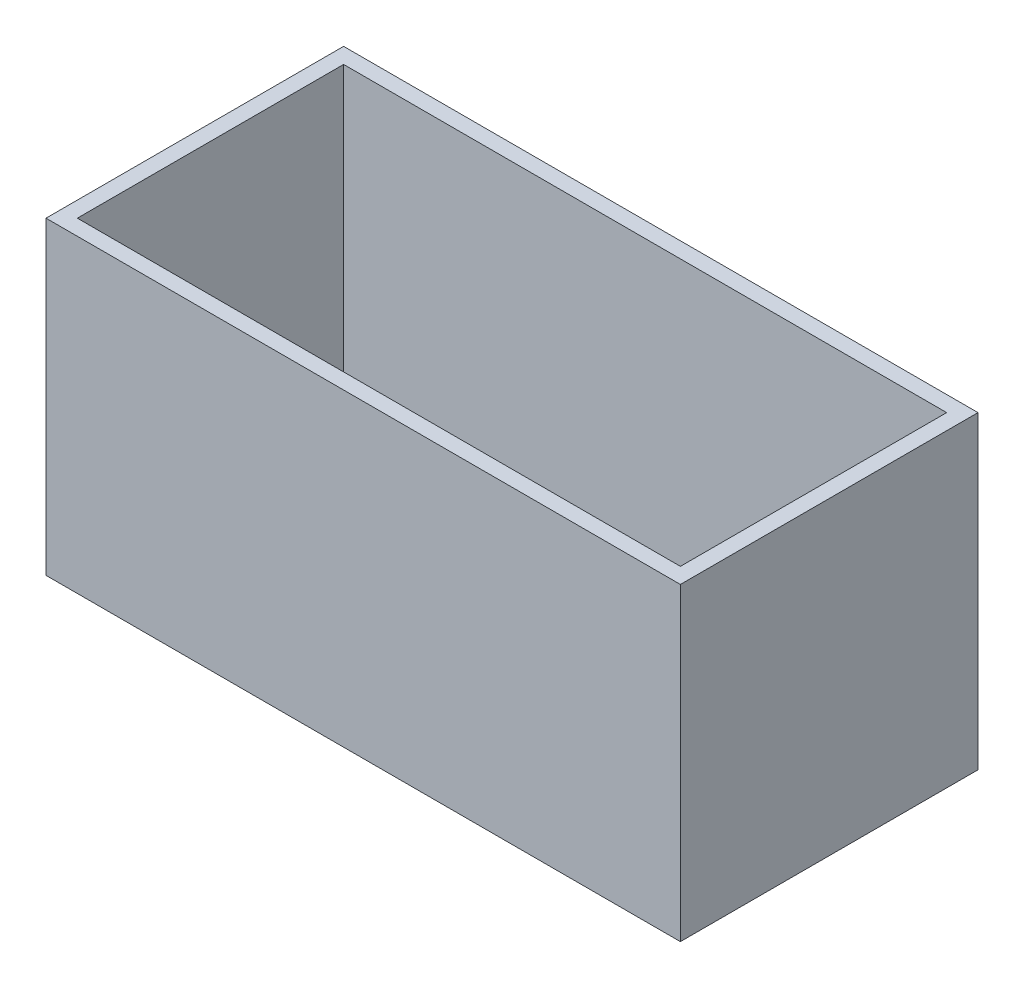
ISO-10303-21;
HEADER;
FILE_DESCRIPTION(('STEP AP214'),'2;1');
FILE_NAME('part.step','',(''),(''),'','','');
FILE_SCHEMA(('AUTOMOTIVE_DESIGN { 1 0 10303 214 1 1 1 1 }'));
ENDSEC;
DATA;
#1=APPLICATION_CONTEXT('core data for automotive mechanical design processes');
#2=APPLICATION_PROTOCOL_DEFINITION('international standard','automotive_design',2000,#1);
#3=PRODUCT_CONTEXT('',#1,'mechanical');
#4=PRODUCT('Part','Part','',(#3));
#5=PRODUCT_RELATED_PRODUCT_CATEGORY('part','',(#4));
#6=PRODUCT_DEFINITION_FORMATION('','',#4);
#7=PRODUCT_DEFINITION_CONTEXT('part definition',#1,'design');
#8=PRODUCT_DEFINITION('design','',#6,#7);
#9=PRODUCT_DEFINITION_SHAPE('','',#8);
#10=(LENGTH_UNIT() NAMED_UNIT(*) SI_UNIT(.MILLI.,.METRE.));
#11=(NAMED_UNIT(*) PLANE_ANGLE_UNIT() SI_UNIT($,.RADIAN.));
#12=(NAMED_UNIT(*) SI_UNIT($,.STERADIAN.) SOLID_ANGLE_UNIT());
#13=UNCERTAINTY_MEASURE_WITH_UNIT(LENGTH_MEASURE(1.E-05),#10,'distance_accuracy_value','');
#14=(GEOMETRIC_REPRESENTATION_CONTEXT(3) GLOBAL_UNCERTAINTY_ASSIGNED_CONTEXT((#13)) GLOBAL_UNIT_ASSIGNED_CONTEXT((#10,
#11,#12)) REPRESENTATION_CONTEXT('',''));
#15=CARTESIAN_POINT('',(0.,0.,0.));
#16=DIRECTION('',(0.,0.,1.));
#17=DIRECTION('',(1.,0.,0.));
#18=AXIS2_PLACEMENT_3D('',#15,#16,#17);
#19=CARTESIAN_POINT('',(102.87,5.08,48.26));
#20=DIRECTION('',(-1.,0.,0.));
#21=DIRECTION('',(0.,0.,1.));
#22=AXIS2_PLACEMENT_3D('',#19,#20,#21);
#23=PLANE('',#22);
#24=DIRECTION('',(0.,0.,-1.));
#25=VECTOR('',#24,1.);
#26=CARTESIAN_POINT('',(102.87,0.,48.26));
#27=LINE('',#26,#25);
#28=CARTESIAN_POINT('',(102.87,0.,48.26));
#29=VERTEX_POINT('',#28);
#30=CARTESIAN_POINT('',(102.87,0.,-48.26));
#31=VERTEX_POINT('',#30);
#32=EDGE_CURVE('E191',#29,#31,#27,.T.);
#33=ORIENTED_EDGE('',*,*,#32,.T.);
#34=DIRECTION('',(0.,-1.,0.));
#35=VECTOR('',#34,1.);
#36=CARTESIAN_POINT('',(102.87,5.08,-48.26));
#37=LINE('',#36,#35);
#38=CARTESIAN_POINT('',(102.87,100.33,-48.26));
#39=VERTEX_POINT('',#38);
#40=EDGE_CURVE('E209',#39,#31,#37,.T.);
#41=ORIENTED_EDGE('',*,*,#40,.F.);
#42=DIRECTION('',(0.,0.,-1.));
#43=VECTOR('',#42,1.);
#44=CARTESIAN_POINT('',(102.87,100.33,-48.26));
#45=LINE('',#44,#43);
#46=CARTESIAN_POINT('',(102.87,100.33,48.26));
#47=VERTEX_POINT('',#46);
#48=EDGE_CURVE('E185',#47,#39,#45,.T.);
#49=ORIENTED_EDGE('',*,*,#48,.F.);
#50=DIRECTION('',(0.,-1.,0.));
#51=VECTOR('',#50,1.);
#52=CARTESIAN_POINT('',(102.87,5.08,48.26));
#53=LINE('',#52,#51);
#54=EDGE_CURVE('E200',#47,#29,#53,.T.);
#55=ORIENTED_EDGE('',*,*,#54,.T.);
#56=EDGE_LOOP('',(#33,#41,#49,#55));
#57=FACE_BOUND('',#56,.T.);
#58=ADVANCED_FACE('F33',(#57),#23,.F.);
#59=CARTESIAN_POINT('',(-102.87,5.08,-48.26));
#60=DIRECTION('',(0.,0.,1.));
#61=DIRECTION('',(1.,0.,0.));
#62=AXIS2_PLACEMENT_3D('',#59,#60,#61);
#63=PLANE('',#62);
#64=DIRECTION('',(-1.,0.,0.));
#65=VECTOR('',#64,1.);
#66=CARTESIAN_POINT('',(-102.87,0.,-48.26));
#67=LINE('',#66,#65);
#68=CARTESIAN_POINT('',(-102.87,0.,-48.26));
#69=VERTEX_POINT('',#68);
#70=EDGE_CURVE('E194',#31,#69,#67,.T.);
#71=ORIENTED_EDGE('',*,*,#70,.T.);
#72=DIRECTION('',(0.,-1.,0.));
#73=VECTOR('',#72,1.);
#74=CARTESIAN_POINT('',(-102.87,5.08,-48.26));
#75=LINE('',#74,#73);
#76=CARTESIAN_POINT('',(-102.87,100.33,-48.26));
#77=VERTEX_POINT('',#76);
#78=EDGE_CURVE('E206',#77,#69,#75,.T.);
#79=ORIENTED_EDGE('',*,*,#78,.F.);
#80=DIRECTION('',(-1.,0.,0.));
#81=VECTOR('',#80,1.);
#82=CARTESIAN_POINT('',(-102.87,100.33,-48.26));
#83=LINE('',#82,#81);
#84=EDGE_CURVE('E188',#39,#77,#83,.T.);
#85=ORIENTED_EDGE('',*,*,#84,.F.);
#86=ORIENTED_EDGE('',*,*,#40,.T.);
#87=EDGE_LOOP('',(#71,#79,#85,#86));
#88=FACE_BOUND('',#87,.T.);
#89=ADVANCED_FACE('F234',(#88),#63,.F.);
#90=CARTESIAN_POINT('',(-102.87,5.08,48.26));
#91=DIRECTION('',(1.,0.,0.));
#92=DIRECTION('',(0.,0.,-1.));
#93=AXIS2_PLACEMENT_3D('',#90,#91,#92);
#94=PLANE('',#93);
#95=DIRECTION('',(0.,0.,1.));
#96=VECTOR('',#95,1.);
#97=CARTESIAN_POINT('',(-102.87,0.,48.26));
#98=LINE('',#97,#96);
#99=CARTESIAN_POINT('',(-102.87,0.,48.26));
#100=VERTEX_POINT('',#99);
#101=EDGE_CURVE('E196',#69,#100,#98,.T.);
#102=ORIENTED_EDGE('',*,*,#101,.T.);
#103=DIRECTION('',(0.,-1.,0.));
#104=VECTOR('',#103,1.);
#105=CARTESIAN_POINT('',(-102.87,5.08,48.26));
#106=LINE('',#105,#104);
#107=CARTESIAN_POINT('',(-102.87,100.33,48.26));
#108=VERTEX_POINT('',#107);
#109=EDGE_CURVE('E203',#108,#100,#106,.T.);
#110=ORIENTED_EDGE('',*,*,#109,.F.);
#111=DIRECTION('',(0.,0.,1.));
#112=VECTOR('',#111,1.);
#113=CARTESIAN_POINT('',(-102.87,100.33,48.26));
#114=LINE('',#113,#112);
#115=EDGE_CURVE('E179',#77,#108,#114,.T.);
#116=ORIENTED_EDGE('',*,*,#115,.F.);
#117=ORIENTED_EDGE('',*,*,#78,.T.);
#118=EDGE_LOOP('',(#102,#110,#116,#117));
#119=FACE_BOUND('',#118,.T.);
#120=ADVANCED_FACE('F239',(#119),#94,.F.);
#121=CARTESIAN_POINT('',(-102.87,5.08,48.26));
#122=DIRECTION('',(0.,0.,-1.));
#123=DIRECTION('',(-1.,0.,0.));
#124=AXIS2_PLACEMENT_3D('',#121,#122,#123);
#125=PLANE('',#124);
#126=DIRECTION('',(1.,0.,0.));
#127=VECTOR('',#126,1.);
#128=CARTESIAN_POINT('',(-102.87,0.,48.26));
#129=LINE('',#128,#127);
#130=EDGE_CURVE('E198',#100,#29,#129,.T.);
#131=ORIENTED_EDGE('',*,*,#130,.T.);
#132=ORIENTED_EDGE('',*,*,#54,.F.);
#133=DIRECTION('',(1.,0.,0.));
#134=VECTOR('',#133,1.);
#135=CARTESIAN_POINT('',(102.87,100.33,48.26));
#136=LINE('',#135,#134);
#137=EDGE_CURVE('E182',#108,#47,#136,.T.);
#138=ORIENTED_EDGE('',*,*,#137,.F.);
#139=ORIENTED_EDGE('',*,*,#109,.T.);
#140=EDGE_LOOP('',(#131,#132,#138,#139));
#141=FACE_BOUND('',#140,.T.);
#142=ADVANCED_FACE('F253',(#141),#125,.F.);
#143=CARTESIAN_POINT('',(0.,0.,0.));
#144=DIRECTION('',(0.,-1.,0.));
#145=DIRECTION('',(0.,0.,-1.));
#146=AXIS2_PLACEMENT_3D('',#143,#144,#145);
#147=PLANE('',#146);
#148=DIRECTION('',(0.,0.,1.));
#149=VECTOR('',#148,1.);
#150=CARTESIAN_POINT('',(11.2450040576355,0.,41.2070214480463));
#151=LINE('',#150,#149);
#152=CARTESIAN_POINT('',(11.2450040576355,0.,32.9212289845254));
#153=VERTEX_POINT('',#152);
#154=CARTESIAN_POINT('',(11.2450040576355,0.,41.2070214480463));
#155=VERTEX_POINT('',#154);
#156=EDGE_CURVE('E47',#153,#155,#151,.T.);
#157=ORIENTED_EDGE('',*,*,#156,.F.);
#158=DIRECTION('',(1.,0.,0.));
#159=VECTOR('',#158,1.);
#160=CARTESIAN_POINT('',(-11.2450040576355,0.,32.9212289845254));
#161=LINE('',#160,#159);
#162=CARTESIAN_POINT('',(-11.2450040576355,0.,32.9212289845254));
#163=VERTEX_POINT('',#162);
#164=EDGE_CURVE('E140',#163,#153,#161,.T.);
#165=ORIENTED_EDGE('',*,*,#164,.F.);
#166=DIRECTION('',(0.,0.,-1.));
#167=VECTOR('',#166,1.);
#168=CARTESIAN_POINT('',(-11.2450040576355,0.,41.2070214480463));
#169=LINE('',#168,#167);
#170=CARTESIAN_POINT('',(-11.2450040576355,0.,41.2070214480463));
#171=VERTEX_POINT('',#170);
#172=EDGE_CURVE('E124',#171,#163,#169,.T.);
#173=ORIENTED_EDGE('',*,*,#172,.F.);
#174=DIRECTION('',(-1.,0.,0.));
#175=VECTOR('',#174,1.);
#176=CARTESIAN_POINT('',(-11.2450040576355,0.,41.2070214480463));
#177=LINE('',#176,#175);
#178=EDGE_CURVE('E133',#155,#171,#177,.T.);
#179=ORIENTED_EDGE('',*,*,#178,.F.);
#180=EDGE_LOOP('',(#157,#165,#173,#179));
#181=FACE_BOUND('',#180,.T.);
#182=ORIENTED_EDGE('',*,*,#32,.F.);
#183=ORIENTED_EDGE('',*,*,#130,.F.);
#184=ORIENTED_EDGE('',*,*,#101,.F.);
#185=ORIENTED_EDGE('',*,*,#70,.F.);
#186=EDGE_LOOP('',(#182,#183,#184,#185));
#187=FACE_BOUND('',#186,.T.);
#188=ADVANCED_FACE('F137',(#181,#187),#147,.T.);
#189=CARTESIAN_POINT('',(0.,100.33,0.));
#190=DIRECTION('',(0.,-1.,0.));
#191=DIRECTION('',(0.,0.,-1.));
#192=AXIS2_PLACEMENT_3D('',#189,#190,#191);
#193=PLANE('',#192);
#194=ORIENTED_EDGE('',*,*,#115,.T.);
#195=ORIENTED_EDGE('',*,*,#137,.T.);
#196=ORIENTED_EDGE('',*,*,#48,.T.);
#197=ORIENTED_EDGE('',*,*,#84,.T.);
#198=EDGE_LOOP('',(#194,#195,#196,#197));
#199=FACE_BOUND('',#198,.T.);
#200=DIRECTION('',(1.,0.,0.));
#201=VECTOR('',#200,1.);
#202=CARTESIAN_POINT('',(-97.79,100.33,43.18));
#203=LINE('',#202,#201);
#204=CARTESIAN_POINT('',(-97.79,100.33,43.18));
#205=VERTEX_POINT('',#204);
#206=CARTESIAN_POINT('',(97.79,100.33,43.18));
#207=VERTEX_POINT('',#206);
#208=EDGE_CURVE('E150',#205,#207,#203,.T.);
#209=ORIENTED_EDGE('',*,*,#208,.F.);
#210=DIRECTION('',(0.,0.,1.));
#211=VECTOR('',#210,1.);
#212=CARTESIAN_POINT('',(-97.79,100.33,-43.18));
#213=LINE('',#212,#211);
#214=CARTESIAN_POINT('',(-97.79,100.33,-43.18));
#215=VERTEX_POINT('',#214);
#216=EDGE_CURVE('E158',#215,#205,#213,.T.);
#217=ORIENTED_EDGE('',*,*,#216,.F.);
#218=DIRECTION('',(-1.,0.,0.));
#219=VECTOR('',#218,1.);
#220=CARTESIAN_POINT('',(97.79,100.33,-43.18));
#221=LINE('',#220,#219);
#222=CARTESIAN_POINT('',(97.79,100.33,-43.18));
#223=VERTEX_POINT('',#222);
#224=EDGE_CURVE('E155',#223,#215,#221,.T.);
#225=ORIENTED_EDGE('',*,*,#224,.F.);
#226=DIRECTION('',(0.,0.,-1.));
#227=VECTOR('',#226,1.);
#228=CARTESIAN_POINT('',(97.79,100.33,43.18));
#229=LINE('',#228,#227);
#230=EDGE_CURVE('E152',#207,#223,#229,.T.);
#231=ORIENTED_EDGE('',*,*,#230,.F.);
#232=EDGE_LOOP('',(#209,#217,#225,#231));
#233=FACE_BOUND('',#232,.T.);
#234=ADVANCED_FACE('F248',(#199,#233),#193,.F.);
#235=CARTESIAN_POINT('',(-97.79,100.33,43.18));
#236=DIRECTION('',(0.,0.,-1.));
#237=DIRECTION('',(-1.,0.,0.));
#238=AXIS2_PLACEMENT_3D('',#235,#236,#237);
#239=PLANE('',#238);
#240=DIRECTION('',(1.,0.,0.));
#241=VECTOR('',#240,1.);
#242=CARTESIAN_POINT('',(-97.79,5.08,43.18));
#243=LINE('',#242,#241);
#244=CARTESIAN_POINT('',(-97.79,5.08,43.18));
#245=VERTEX_POINT('',#244);
#246=CARTESIAN_POINT('',(97.79,5.08,43.18));
#247=VERTEX_POINT('',#246);
#248=EDGE_CURVE('E147',#245,#247,#243,.T.);
#249=ORIENTED_EDGE('',*,*,#248,.F.);
#250=DIRECTION('',(0.,-1.,0.));
#251=VECTOR('',#250,1.);
#252=CARTESIAN_POINT('',(-97.79,100.33,43.18));
#253=LINE('',#252,#251);
#254=EDGE_CURVE('E160',#205,#245,#253,.T.);
#255=ORIENTED_EDGE('',*,*,#254,.F.);
#256=ORIENTED_EDGE('',*,*,#208,.T.);
#257=DIRECTION('',(0.,-1.,0.));
#258=VECTOR('',#257,1.);
#259=CARTESIAN_POINT('',(97.79,100.33,43.18));
#260=LINE('',#259,#258);
#261=EDGE_CURVE('E176',#207,#247,#260,.T.);
#262=ORIENTED_EDGE('',*,*,#261,.T.);
#263=EDGE_LOOP('',(#249,#255,#256,#262));
#264=FACE_BOUND('',#263,.T.);
#265=ADVANCED_FACE('F265',(#264),#239,.T.);
#266=CARTESIAN_POINT('',(97.79,100.33,43.18));
#267=DIRECTION('',(-1.,0.,0.));
#268=DIRECTION('',(0.,0.,1.));
#269=AXIS2_PLACEMENT_3D('',#266,#267,#268);
#270=PLANE('',#269);
#271=DIRECTION('',(0.,0.,-1.));
#272=VECTOR('',#271,1.);
#273=CARTESIAN_POINT('',(97.79,5.08,43.18));
#274=LINE('',#273,#272);
#275=CARTESIAN_POINT('',(97.79,5.08,-43.18));
#276=VERTEX_POINT('',#275);
#277=EDGE_CURVE('E163',#247,#276,#274,.T.);
#278=ORIENTED_EDGE('',*,*,#277,.F.);
#279=ORIENTED_EDGE('',*,*,#261,.F.);
#280=ORIENTED_EDGE('',*,*,#230,.T.);
#281=DIRECTION('',(0.,-1.,0.));
#282=VECTOR('',#281,1.);
#283=CARTESIAN_POINT('',(97.79,100.33,-43.18));
#284=LINE('',#283,#282);
#285=EDGE_CURVE('E174',#223,#276,#284,.T.);
#286=ORIENTED_EDGE('',*,*,#285,.T.);
#287=EDGE_LOOP('',(#278,#279,#280,#286));
#288=FACE_BOUND('',#287,.T.);
#289=ADVANCED_FACE('F268',(#288),#270,.T.);
#290=CARTESIAN_POINT('',(97.79,100.33,-43.18));
#291=DIRECTION('',(0.,0.,1.));
#292=DIRECTION('',(1.,0.,0.));
#293=AXIS2_PLACEMENT_3D('',#290,#291,#292);
#294=PLANE('',#293);
#295=DIRECTION('',(-1.,0.,0.));
#296=VECTOR('',#295,1.);
#297=CARTESIAN_POINT('',(97.79,5.08,-43.18));
#298=LINE('',#297,#296);
#299=CARTESIAN_POINT('',(-97.79,5.08,-43.18));
#300=VERTEX_POINT('',#299);
#301=EDGE_CURVE('E166',#276,#300,#298,.T.);
#302=ORIENTED_EDGE('',*,*,#301,.F.);
#303=ORIENTED_EDGE('',*,*,#285,.F.);
#304=ORIENTED_EDGE('',*,*,#224,.T.);
#305=DIRECTION('',(0.,-1.,0.));
#306=VECTOR('',#305,1.);
#307=CARTESIAN_POINT('',(-97.79,100.33,-43.18));
#308=LINE('',#307,#306);
#309=EDGE_CURVE('E172',#215,#300,#308,.T.);
#310=ORIENTED_EDGE('',*,*,#309,.T.);
#311=EDGE_LOOP('',(#302,#303,#304,#310));
#312=FACE_BOUND('',#311,.T.);
#313=ADVANCED_FACE('F272',(#312),#294,.T.);
#314=CARTESIAN_POINT('',(-97.79,100.33,-43.18));
#315=DIRECTION('',(1.,0.,0.));
#316=DIRECTION('',(0.,0.,-1.));
#317=AXIS2_PLACEMENT_3D('',#314,#315,#316);
#318=PLANE('',#317);
#319=DIRECTION('',(0.,0.,1.));
#320=VECTOR('',#319,1.);
#321=CARTESIAN_POINT('',(-97.79,5.08,-43.18));
#322=LINE('',#321,#320);
#323=EDGE_CURVE('E153',#300,#245,#322,.T.);
#324=ORIENTED_EDGE('',*,*,#323,.F.);
#325=ORIENTED_EDGE('',*,*,#309,.F.);
#326=ORIENTED_EDGE('',*,*,#216,.T.);
#327=ORIENTED_EDGE('',*,*,#254,.T.);
#328=EDGE_LOOP('',(#324,#325,#326,#327));
#329=FACE_BOUND('',#328,.T.);
#330=ADVANCED_FACE('F229',(#329),#318,.T.);
#331=CARTESIAN_POINT('',(0.,5.08,0.));
#332=DIRECTION('',(0.,-1.,0.));
#333=DIRECTION('',(0.,0.,-1.));
#334=AXIS2_PLACEMENT_3D('',#331,#332,#333);
#335=PLANE('',#334);
#336=DIRECTION('',(1.,0.,0.));
#337=VECTOR('',#336,1.);
#338=CARTESIAN_POINT('',(0.,5.08,32.9212289845254));
#339=LINE('',#338,#337);
#340=CARTESIAN_POINT('',(-11.2450040576355,5.08,32.9212289845254));
#341=VERTEX_POINT('',#340);
#342=CARTESIAN_POINT('',(11.2450040576355,5.08,32.9212289845254));
#343=VERTEX_POINT('',#342);
#344=EDGE_CURVE('E40',#341,#343,#339,.T.);
#345=ORIENTED_EDGE('',*,*,#344,.T.);
#346=DIRECTION('',(0.,0.,1.));
#347=VECTOR('',#346,1.);
#348=CARTESIAN_POINT('',(11.2450040576355,5.08,0.));
#349=LINE('',#348,#347);
#350=CARTESIAN_POINT('',(11.2450040576355,5.08,41.2070214480463));
#351=VERTEX_POINT('',#350);
#352=EDGE_CURVE('E11',#343,#351,#349,.T.);
#353=ORIENTED_EDGE('',*,*,#352,.T.);
#354=DIRECTION('',(-1.,0.,0.));
#355=VECTOR('',#354,1.);
#356=CARTESIAN_POINT('',(0.,5.08,41.2070214480463));
#357=LINE('',#356,#355);
#358=CARTESIAN_POINT('',(-11.2450040576355,5.08,41.2070214480463));
#359=VERTEX_POINT('',#358);
#360=EDGE_CURVE('E212',#351,#359,#357,.T.);
#361=ORIENTED_EDGE('',*,*,#360,.T.);
#362=DIRECTION('',(0.,0.,-1.));
#363=VECTOR('',#362,1.);
#364=CARTESIAN_POINT('',(-11.2450040576355,5.08,0.));
#365=LINE('',#364,#363);
#366=EDGE_CURVE('E127',#359,#341,#365,.T.);
#367=ORIENTED_EDGE('',*,*,#366,.T.);
#368=EDGE_LOOP('',(#345,#353,#361,#367));
#369=FACE_BOUND('',#368,.T.);
#370=ORIENTED_EDGE('',*,*,#323,.T.);
#371=ORIENTED_EDGE('',*,*,#248,.T.);
#372=ORIENTED_EDGE('',*,*,#277,.T.);
#373=ORIENTED_EDGE('',*,*,#301,.T.);
#374=EDGE_LOOP('',(#370,#371,#372,#373));
#375=FACE_BOUND('',#374,.T.);
#376=ADVANCED_FACE('F216',(#369,#375),#335,.F.);
#377=CARTESIAN_POINT('',(11.2450040576355,95.25,41.2070214480463));
#378=DIRECTION('',(1.,0.,0.));
#379=DIRECTION('',(0.,0.,-1.));
#380=AXIS2_PLACEMENT_3D('',#377,#378,#379);
#381=PLANE('',#380);
#382=DIRECTION('',(0.,-1.,0.));
#383=VECTOR('',#382,1.);
#384=CARTESIAN_POINT('',(11.2450040576355,95.25,32.9212289845254));
#385=LINE('',#384,#383);
#386=EDGE_CURVE('E145',#343,#153,#385,.T.);
#387=ORIENTED_EDGE('',*,*,#386,.T.);
#388=ORIENTED_EDGE('',*,*,#156,.T.);
#389=DIRECTION('',(0.,-1.,0.));
#390=VECTOR('',#389,1.);
#391=CARTESIAN_POINT('',(11.2450040576355,95.25,41.2070214480463));
#392=LINE('',#391,#390);
#393=EDGE_CURVE('E130',#351,#155,#392,.T.);
#394=ORIENTED_EDGE('',*,*,#393,.F.);
#395=ORIENTED_EDGE('',*,*,#352,.F.);
#396=EDGE_LOOP('',(#387,#388,#394,#395));
#397=FACE_BOUND('',#396,.T.);
#398=ADVANCED_FACE('F221',(#397),#381,.F.);
#399=CARTESIAN_POINT('',(-11.2450040576355,95.25,32.9212289845254));
#400=DIRECTION('',(0.,0.,-1.));
#401=DIRECTION('',(-1.,0.,0.));
#402=AXIS2_PLACEMENT_3D('',#399,#400,#401);
#403=PLANE('',#402);
#404=DIRECTION('',(0.,-1.,0.));
#405=VECTOR('',#404,1.);
#406=CARTESIAN_POINT('',(-11.2450040576355,95.25,32.9212289845254));
#407=LINE('',#406,#405);
#408=EDGE_CURVE('E129',#341,#163,#407,.T.);
#409=ORIENTED_EDGE('',*,*,#408,.T.);
#410=ORIENTED_EDGE('',*,*,#164,.T.);
#411=ORIENTED_EDGE('',*,*,#386,.F.);
#412=ORIENTED_EDGE('',*,*,#344,.F.);
#413=EDGE_LOOP('',(#409,#410,#411,#412));
#414=FACE_BOUND('',#413,.T.);
#415=ADVANCED_FACE('F220',(#414),#403,.F.);
#416=CARTESIAN_POINT('',(-11.2450040576355,95.25,41.2070214480463));
#417=DIRECTION('',(-1.,0.,0.));
#418=DIRECTION('',(0.,0.,1.));
#419=AXIS2_PLACEMENT_3D('',#416,#417,#418);
#420=PLANE('',#419);
#421=DIRECTION('',(0.,-1.,0.));
#422=VECTOR('',#421,1.);
#423=CARTESIAN_POINT('',(-11.2450040576355,95.25,41.2070214480463));
#424=LINE('',#423,#422);
#425=EDGE_CURVE('E55',#359,#171,#424,.T.);
#426=ORIENTED_EDGE('',*,*,#425,.T.);
#427=ORIENTED_EDGE('',*,*,#172,.T.);
#428=ORIENTED_EDGE('',*,*,#408,.F.);
#429=ORIENTED_EDGE('',*,*,#366,.F.);
#430=EDGE_LOOP('',(#426,#427,#428,#429));
#431=FACE_BOUND('',#430,.T.);
#432=ADVANCED_FACE('F121',(#431),#420,.F.);
#433=CARTESIAN_POINT('',(-11.2450040576355,95.25,41.2070214480463));
#434=DIRECTION('',(0.,0.,1.));
#435=DIRECTION('',(1.,0.,0.));
#436=AXIS2_PLACEMENT_3D('',#433,#434,#435);
#437=PLANE('',#436);
#438=ORIENTED_EDGE('',*,*,#393,.T.);
#439=ORIENTED_EDGE('',*,*,#178,.T.);
#440=ORIENTED_EDGE('',*,*,#425,.F.);
#441=ORIENTED_EDGE('',*,*,#360,.F.);
#442=EDGE_LOOP('',(#438,#439,#440,#441));
#443=FACE_BOUND('',#442,.T.);
#444=ADVANCED_FACE('F134',(#443),#437,.F.);
#445=CLOSED_SHELL('',(#58,#89,#120,#142,#188,#234,#265,#289,#313,#330,#376,#398,#415,#432,#444));
#446=MANIFOLD_SOLID_BREP('B2',#445);
#447=ADVANCED_BREP_SHAPE_REPRESENTATION('',(#18,#446),#14);
#448=SHAPE_DEFINITION_REPRESENTATION(#9,#447);
ENDSEC;
END-ISO-10303-21;
